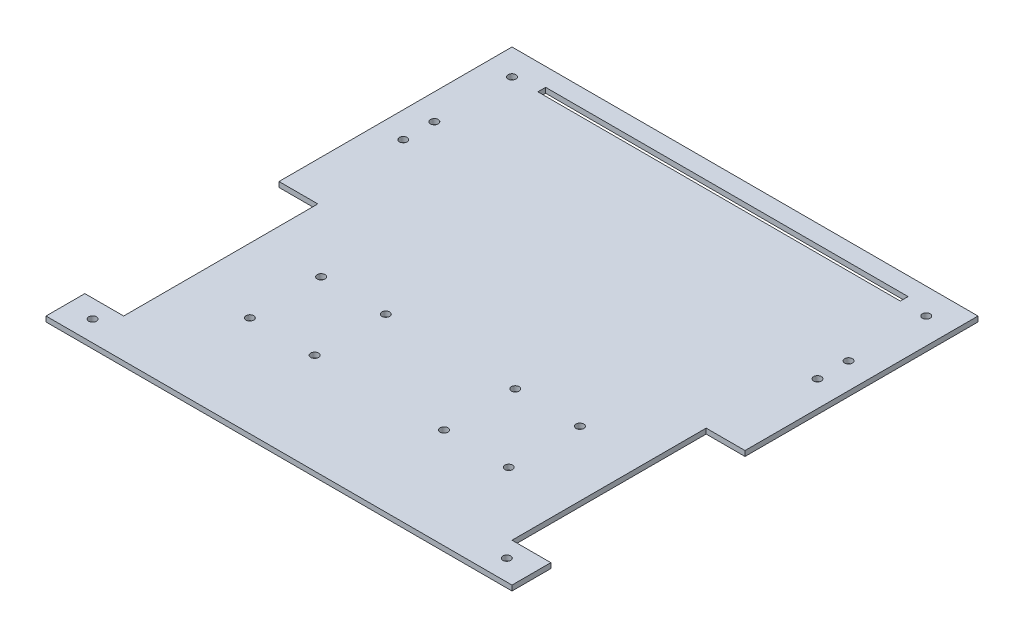
ISO-10303-21;
HEADER;
FILE_DESCRIPTION(('STEP AP214'),'2;1');
FILE_NAME('part.step','',(''),(''),'','','');
FILE_SCHEMA(('AUTOMOTIVE_DESIGN { 1 0 10303 214 1 1 1 1 }'));
ENDSEC;
DATA;
#1=APPLICATION_CONTEXT('core data for automotive mechanical design processes');
#2=APPLICATION_PROTOCOL_DEFINITION('international standard','automotive_design',2000,#1);
#3=PRODUCT_CONTEXT('',#1,'mechanical');
#4=PRODUCT('Part','Part','',(#3));
#5=PRODUCT_RELATED_PRODUCT_CATEGORY('part','',(#4));
#6=PRODUCT_DEFINITION_FORMATION('','',#4);
#7=PRODUCT_DEFINITION_CONTEXT('part definition',#1,'design');
#8=PRODUCT_DEFINITION('design','',#6,#7);
#9=PRODUCT_DEFINITION_SHAPE('','',#8);
#10=(LENGTH_UNIT() NAMED_UNIT(*) SI_UNIT(.MILLI.,.METRE.));
#11=(NAMED_UNIT(*) PLANE_ANGLE_UNIT() SI_UNIT($,.RADIAN.));
#12=(NAMED_UNIT(*) SI_UNIT($,.STERADIAN.) SOLID_ANGLE_UNIT());
#13=UNCERTAINTY_MEASURE_WITH_UNIT(LENGTH_MEASURE(1.E-05),#10,'distance_accuracy_value','');
#14=(GEOMETRIC_REPRESENTATION_CONTEXT(3) GLOBAL_UNCERTAINTY_ASSIGNED_CONTEXT((#13)) GLOBAL_UNIT_ASSIGNED_CONTEXT((#10,
#11,#12)) REPRESENTATION_CONTEXT('',''));
#15=CARTESIAN_POINT('',(0.,0.,0.));
#16=DIRECTION('',(0.,0.,1.));
#17=DIRECTION('',(1.,0.,0.));
#18=AXIS2_PLACEMENT_3D('',#15,#16,#17);
#19=CARTESIAN_POINT('',(90.,2.,-90.));
#20=DIRECTION('',(-1.,0.,0.));
#21=DIRECTION('',(0.,0.,1.));
#22=AXIS2_PLACEMENT_3D('',#19,#20,#21);
#23=PLANE('',#22);
#24=DIRECTION('',(0.,0.,-1.));
#25=VECTOR('',#24,1.);
#26=CARTESIAN_POINT('',(90.,0.,-90.));
#27=LINE('',#26,#25);
#28=CARTESIAN_POINT('',(90.,0.,90.));
#29=VERTEX_POINT('',#28);
#30=CARTESIAN_POINT('',(90.,0.,75.));
#31=VERTEX_POINT('',#30);
#32=EDGE_CURVE('E354',#29,#31,#27,.T.);
#33=ORIENTED_EDGE('',*,*,#32,.T.);
#34=DIRECTION('',(0.,1.,0.));
#35=VECTOR('',#34,1.);
#36=CARTESIAN_POINT('',(90.,0.,75.));
#37=LINE('',#36,#35);
#38=CARTESIAN_POINT('',(90.,2.,75.));
#39=VERTEX_POINT('',#38);
#40=EDGE_CURVE('E266',#31,#39,#37,.T.);
#41=ORIENTED_EDGE('',*,*,#40,.T.);
#42=DIRECTION('',(0.,0.,-1.));
#43=VECTOR('',#42,1.);
#44=CARTESIAN_POINT('',(90.,2.,-90.));
#45=LINE('',#44,#43);
#46=CARTESIAN_POINT('',(90.,2.,90.));
#47=VERTEX_POINT('',#46);
#48=EDGE_CURVE('E337',#47,#39,#45,.T.);
#49=ORIENTED_EDGE('',*,*,#48,.F.);
#50=DIRECTION('',(0.,-1.,0.));
#51=VECTOR('',#50,1.);
#52=CARTESIAN_POINT('',(90.,2.,90.));
#53=LINE('',#52,#51);
#54=EDGE_CURVE('E353',#47,#29,#53,.T.);
#55=ORIENTED_EDGE('',*,*,#54,.T.);
#56=EDGE_LOOP('',(#33,#41,#49,#55));
#57=FACE_BOUND('',#56,.T.);
#58=ADVANCED_FACE('F39',(#57),#23,.F.);
#59=CARTESIAN_POINT('',(-90.,2.,-90.));
#60=DIRECTION('',(1.,0.,0.));
#61=DIRECTION('',(0.,0.,-1.));
#62=AXIS2_PLACEMENT_3D('',#59,#60,#61);
#63=PLANE('',#62);
#64=DIRECTION('',(0.,0.,1.));
#65=VECTOR('',#64,1.);
#66=CARTESIAN_POINT('',(-90.,0.,-90.));
#67=LINE('',#66,#65);
#68=CARTESIAN_POINT('',(-90.,0.,-90.));
#69=VERTEX_POINT('',#68);
#70=CARTESIAN_POINT('',(-90.,0.,0.));
#71=VERTEX_POINT('',#70);
#72=EDGE_CURVE('E362',#69,#71,#67,.T.);
#73=ORIENTED_EDGE('',*,*,#72,.T.);
#74=DIRECTION('',(0.,1.,0.));
#75=VECTOR('',#74,1.);
#76=CARTESIAN_POINT('',(-90.,0.,0.));
#77=LINE('',#76,#75);
#78=CARTESIAN_POINT('',(-90.,2.,0.));
#79=VERTEX_POINT('',#78);
#80=EDGE_CURVE('E324',#71,#79,#77,.T.);
#81=ORIENTED_EDGE('',*,*,#80,.T.);
#82=DIRECTION('',(0.,0.,1.));
#83=VECTOR('',#82,1.);
#84=CARTESIAN_POINT('',(-90.,2.,-90.));
#85=LINE('',#84,#83);
#86=CARTESIAN_POINT('',(-90.,2.,-90.));
#87=VERTEX_POINT('',#86);
#88=EDGE_CURVE('E346',#87,#79,#85,.T.);
#89=ORIENTED_EDGE('',*,*,#88,.F.);
#90=DIRECTION('',(0.,-1.,0.));
#91=VECTOR('',#90,1.);
#92=CARTESIAN_POINT('',(-90.,2.,-90.));
#93=LINE('',#92,#91);
#94=EDGE_CURVE('E49',#87,#69,#93,.T.);
#95=ORIENTED_EDGE('',*,*,#94,.T.);
#96=EDGE_LOOP('',(#73,#81,#89,#95));
#97=FACE_BOUND('',#96,.T.);
#98=ADVANCED_FACE('F427',(#97),#63,.F.);
#99=CARTESIAN_POINT('',(90.,2.,0.));
#100=VERTEX_POINT('',#99);
#101=CARTESIAN_POINT('',(90.,2.,-90.));
#102=VERTEX_POINT('',#101);
#103=EDGE_CURVE('E342',#100,#102,#45,.T.);
#104=ORIENTED_EDGE('',*,*,#103,.F.);
#105=DIRECTION('',(0.,1.,0.));
#106=VECTOR('',#105,1.);
#107=CARTESIAN_POINT('',(90.,0.,0.));
#108=LINE('',#107,#106);
#109=CARTESIAN_POINT('',(90.,0.,0.));
#110=VERTEX_POINT('',#109);
#111=EDGE_CURVE('E254',#110,#100,#108,.T.);
#112=ORIENTED_EDGE('',*,*,#111,.F.);
#113=CARTESIAN_POINT('',(90.,0.,-90.));
#114=VERTEX_POINT('',#113);
#115=EDGE_CURVE('E328',#110,#114,#27,.T.);
#116=ORIENTED_EDGE('',*,*,#115,.T.);
#117=DIRECTION('',(0.,-1.,0.));
#118=VECTOR('',#117,1.);
#119=CARTESIAN_POINT('',(90.,2.,-90.));
#120=LINE('',#119,#118);
#121=EDGE_CURVE('E11',#102,#114,#120,.T.);
#122=ORIENTED_EDGE('',*,*,#121,.F.);
#123=EDGE_LOOP('',(#104,#112,#116,#122));
#124=FACE_BOUND('',#123,.T.);
#125=ADVANCED_FACE('F41',(#124),#23,.F.);
#126=CARTESIAN_POINT('',(-90.,2.,-90.));
#127=DIRECTION('',(0.,0.,1.));
#128=DIRECTION('',(1.,0.,0.));
#129=AXIS2_PLACEMENT_3D('',#126,#127,#128);
#130=PLANE('',#129);
#131=DIRECTION('',(-1.,0.,0.));
#132=VECTOR('',#131,1.);
#133=CARTESIAN_POINT('',(-90.,0.,-90.));
#134=LINE('',#133,#132);
#135=EDGE_CURVE('E358',#114,#69,#134,.T.);
#136=ORIENTED_EDGE('',*,*,#135,.T.);
#137=ORIENTED_EDGE('',*,*,#94,.F.);
#138=DIRECTION('',(-1.,0.,0.));
#139=VECTOR('',#138,1.);
#140=CARTESIAN_POINT('',(-90.,2.,-90.));
#141=LINE('',#140,#139);
#142=EDGE_CURVE('E341',#102,#87,#141,.T.);
#143=ORIENTED_EDGE('',*,*,#142,.F.);
#144=ORIENTED_EDGE('',*,*,#121,.T.);
#145=EDGE_LOOP('',(#136,#137,#143,#144));
#146=FACE_BOUND('',#145,.T.);
#147=ADVANCED_FACE('F436',(#146),#130,.F.);
#148=CARTESIAN_POINT('',(-90.,2.,75.));
#149=VERTEX_POINT('',#148);
#150=CARTESIAN_POINT('',(-90.,2.,90.));
#151=VERTEX_POINT('',#150);
#152=EDGE_CURVE('E345',#149,#151,#85,.T.);
#153=ORIENTED_EDGE('',*,*,#152,.F.);
#154=DIRECTION('',(0.,1.,0.));
#155=VECTOR('',#154,1.);
#156=CARTESIAN_POINT('',(-90.,0.,75.));
#157=LINE('',#156,#155);
#158=CARTESIAN_POINT('',(-90.,0.,75.));
#159=VERTEX_POINT('',#158);
#160=EDGE_CURVE('E314',#159,#149,#157,.T.);
#161=ORIENTED_EDGE('',*,*,#160,.F.);
#162=CARTESIAN_POINT('',(-90.,0.,90.));
#163=VERTEX_POINT('',#162);
#164=EDGE_CURVE('E361',#159,#163,#67,.T.);
#165=ORIENTED_EDGE('',*,*,#164,.T.);
#166=DIRECTION('',(0.,-1.,0.));
#167=VECTOR('',#166,1.);
#168=CARTESIAN_POINT('',(-90.,2.,90.));
#169=LINE('',#168,#167);
#170=EDGE_CURVE('E372',#151,#163,#169,.T.);
#171=ORIENTED_EDGE('',*,*,#170,.F.);
#172=EDGE_LOOP('',(#153,#161,#165,#171));
#173=FACE_BOUND('',#172,.T.);
#174=ADVANCED_FACE('F434',(#173),#63,.F.);
#175=CARTESIAN_POINT('',(-90.,2.,90.));
#176=DIRECTION('',(0.,0.,-1.));
#177=DIRECTION('',(-1.,0.,0.));
#178=AXIS2_PLACEMENT_3D('',#175,#176,#177);
#179=PLANE('',#178);
#180=DIRECTION('',(1.,0.,0.));
#181=VECTOR('',#180,1.);
#182=CARTESIAN_POINT('',(-90.,0.,90.));
#183=LINE('',#182,#181);
#184=EDGE_CURVE('E366',#163,#29,#183,.T.);
#185=ORIENTED_EDGE('',*,*,#184,.T.);
#186=ORIENTED_EDGE('',*,*,#54,.F.);
#187=DIRECTION('',(1.,0.,0.));
#188=VECTOR('',#187,1.);
#189=CARTESIAN_POINT('',(-90.,2.,90.));
#190=LINE('',#189,#188);
#191=EDGE_CURVE('E350',#151,#47,#190,.T.);
#192=ORIENTED_EDGE('',*,*,#191,.F.);
#193=ORIENTED_EDGE('',*,*,#170,.T.);
#194=EDGE_LOOP('',(#185,#186,#192,#193));
#195=FACE_BOUND('',#194,.T.);
#196=ADVANCED_FACE('F463',(#195),#179,.F.);
#197=CARTESIAN_POINT('',(0.,2.,0.));
#198=DIRECTION('',(0.,1.,0.));
#199=DIRECTION('',(0.,0.,1.));
#200=AXIS2_PLACEMENT_3D('',#197,#198,#199);
#201=PLANE('',#200);
#202=CARTESIAN_POINT('',(25.,2.,23.75));
#203=DIRECTION('',(0.,1.,0.));
#204=DIRECTION('',(0.,0.,1.));
#205=AXIS2_PLACEMENT_3D('',#202,#203,#204);
#206=CIRCLE('',#205,1.5);
#207=CARTESIAN_POINT('',(25.,2.,25.25));
#208=VERTEX_POINT('',#207);
#209=EDGE_CURVE('E819',#208,#208,#206,.T.);
#210=ORIENTED_EDGE('',*,*,#209,.F.);
#211=EDGE_LOOP('',(#210));
#212=FACE_BOUND('',#211,.T.);
#213=CARTESIAN_POINT('',(-25.,2.,51.25));
#214=DIRECTION('',(0.,1.,0.));
#215=DIRECTION('',(0.,0.,1.));
#216=AXIS2_PLACEMENT_3D('',#213,#214,#215);
#217=CIRCLE('',#216,1.5);
#218=CARTESIAN_POINT('',(-25.,2.,52.75));
#219=VERTEX_POINT('',#218);
#220=EDGE_CURVE('E812',#219,#219,#217,.T.);
#221=ORIENTED_EDGE('',*,*,#220,.F.);
#222=EDGE_LOOP('',(#221));
#223=FACE_BOUND('',#222,.T.);
#224=CARTESIAN_POINT('',(-25.,2.,23.75));
#225=DIRECTION('',(0.,1.,0.));
#226=DIRECTION('',(0.,0.,1.));
#227=AXIS2_PLACEMENT_3D('',#224,#225,#226);
#228=CIRCLE('',#227,1.5);
#229=CARTESIAN_POINT('',(-25.,2.,25.25));
#230=VERTEX_POINT('',#229);
#231=EDGE_CURVE('E754',#230,#230,#228,.T.);
#232=ORIENTED_EDGE('',*,*,#231,.F.);
#233=EDGE_LOOP('',(#232));
#234=FACE_BOUND('',#233,.T.);
#235=CARTESIAN_POINT('',(-50.,2.,51.25));
#236=DIRECTION('',(0.,1.,0.));
#237=DIRECTION('',(0.,0.,1.));
#238=AXIS2_PLACEMENT_3D('',#235,#236,#237);
#239=CIRCLE('',#238,1.5);
#240=CARTESIAN_POINT('',(-50.,2.,52.75));
#241=VERTEX_POINT('',#240);
#242=EDGE_CURVE('E811',#241,#241,#239,.T.);
#243=ORIENTED_EDGE('',*,*,#242,.F.);
#244=EDGE_LOOP('',(#243));
#245=FACE_BOUND('',#244,.T.);
#246=CARTESIAN_POINT('',(50.,2.,51.25));
#247=DIRECTION('',(0.,1.,0.));
#248=DIRECTION('',(0.,0.,1.));
#249=AXIS2_PLACEMENT_3D('',#246,#247,#248);
#250=CIRCLE('',#249,1.5);
#251=CARTESIAN_POINT('',(50.,2.,52.75));
#252=VERTEX_POINT('',#251);
#253=EDGE_CURVE('E834',#252,#252,#250,.T.);
#254=ORIENTED_EDGE('',*,*,#253,.F.);
#255=EDGE_LOOP('',(#254));
#256=FACE_BOUND('',#255,.T.);
#257=CARTESIAN_POINT('',(25.,2.,51.25));
#258=DIRECTION('',(0.,1.,0.));
#259=DIRECTION('',(0.,0.,1.));
#260=AXIS2_PLACEMENT_3D('',#257,#258,#259);
#261=CIRCLE('',#260,1.5);
#262=CARTESIAN_POINT('',(25.,2.,52.75));
#263=VERTEX_POINT('',#262);
#264=EDGE_CURVE('E830',#263,#263,#261,.T.);
#265=ORIENTED_EDGE('',*,*,#264,.F.);
#266=EDGE_LOOP('',(#265));
#267=FACE_BOUND('',#266,.T.);
#268=CARTESIAN_POINT('',(50.,2.,23.75));
#269=DIRECTION('',(0.,1.,0.));
#270=DIRECTION('',(0.,0.,1.));
#271=AXIS2_PLACEMENT_3D('',#268,#269,#270);
#272=CIRCLE('',#271,1.5);
#273=CARTESIAN_POINT('',(50.,2.,25.25));
#274=VERTEX_POINT('',#273);
#275=EDGE_CURVE('E828',#274,#274,#272,.T.);
#276=ORIENTED_EDGE('',*,*,#275,.F.);
#277=EDGE_LOOP('',(#276));
#278=FACE_BOUND('',#277,.T.);
#279=CARTESIAN_POINT('',(-50.,2.,23.75));
#280=DIRECTION('',(0.,1.,0.));
#281=DIRECTION('',(0.,0.,1.));
#282=AXIS2_PLACEMENT_3D('',#279,#280,#281);
#283=CIRCLE('',#282,1.5);
#284=CARTESIAN_POINT('',(-50.,2.,25.25));
#285=VERTEX_POINT('',#284);
#286=EDGE_CURVE('E384',#285,#285,#283,.T.);
#287=ORIENTED_EDGE('',*,*,#286,.F.);
#288=EDGE_LOOP('',(#287));
#289=FACE_BOUND('',#288,.T.);
#290=CARTESIAN_POINT('',(80.,2.,-38.));
#291=DIRECTION('',(0.,1.,0.));
#292=DIRECTION('',(0.,0.,-1.));
#293=AXIS2_PLACEMENT_3D('',#290,#291,#292);
#294=CIRCLE('',#293,1.5);
#295=CARTESIAN_POINT('',(80.,2.,-39.5));
#296=VERTEX_POINT('',#295);
#297=EDGE_CURVE('E232',#296,#296,#294,.T.);
#298=ORIENTED_EDGE('',*,*,#297,.F.);
#299=EDGE_LOOP('',(#298));
#300=FACE_BOUND('',#299,.T.);
#301=CARTESIAN_POINT('',(-80.,2.,-80.));
#302=DIRECTION('',(0.,1.,0.));
#303=DIRECTION('',(0.,0.,1.));
#304=AXIS2_PLACEMENT_3D('',#301,#302,#303);
#305=CIRCLE('',#304,1.5);
#306=CARTESIAN_POINT('',(-80.,2.,-78.5));
#307=VERTEX_POINT('',#306);
#308=EDGE_CURVE('E213',#307,#307,#305,.T.);
#309=ORIENTED_EDGE('',*,*,#308,.F.);
#310=EDGE_LOOP('',(#309));
#311=FACE_BOUND('',#310,.T.);
#312=CARTESIAN_POINT('',(-80.,2.,-50.));
#313=DIRECTION('',(0.,1.,0.));
#314=DIRECTION('',(0.,0.,1.));
#315=AXIS2_PLACEMENT_3D('',#312,#313,#314);
#316=CIRCLE('',#315,1.5);
#317=CARTESIAN_POINT('',(-80.,2.,-48.5));
#318=VERTEX_POINT('',#317);
#319=EDGE_CURVE('E214',#318,#318,#316,.T.);
#320=ORIENTED_EDGE('',*,*,#319,.F.);
#321=EDGE_LOOP('',(#320));
#322=FACE_BOUND('',#321,.T.);
#323=CARTESIAN_POINT('',(80.,2.,-50.));
#324=DIRECTION('',(0.,1.,0.));
#325=DIRECTION('',(0.,0.,-1.));
#326=AXIS2_PLACEMENT_3D('',#323,#324,#325);
#327=CIRCLE('',#326,1.5);
#328=CARTESIAN_POINT('',(80.,2.,-51.5));
#329=VERTEX_POINT('',#328);
#330=EDGE_CURVE('E222',#329,#329,#327,.T.);
#331=ORIENTED_EDGE('',*,*,#330,.F.);
#332=EDGE_LOOP('',(#331));
#333=FACE_BOUND('',#332,.T.);
#334=CARTESIAN_POINT('',(80.,2.,82.));
#335=DIRECTION('',(0.,1.,0.));
#336=DIRECTION('',(0.,0.,-1.));
#337=AXIS2_PLACEMENT_3D('',#334,#335,#336);
#338=CIRCLE('',#337,1.5);
#339=CARTESIAN_POINT('',(80.,2.,80.5));
#340=VERTEX_POINT('',#339);
#341=EDGE_CURVE('E231',#340,#340,#338,.T.);
#342=ORIENTED_EDGE('',*,*,#341,.F.);
#343=EDGE_LOOP('',(#342));
#344=FACE_BOUND('',#343,.T.);
#345=CARTESIAN_POINT('',(-80.,2.,82.));
#346=DIRECTION('',(0.,1.,0.));
#347=DIRECTION('',(0.,0.,1.));
#348=AXIS2_PLACEMENT_3D('',#345,#346,#347);
#349=CIRCLE('',#348,1.5);
#350=CARTESIAN_POINT('',(-80.,2.,83.5));
#351=VERTEX_POINT('',#350);
#352=EDGE_CURVE('E290',#351,#351,#349,.T.);
#353=ORIENTED_EDGE('',*,*,#352,.F.);
#354=EDGE_LOOP('',(#353));
#355=FACE_BOUND('',#354,.T.);
#356=CARTESIAN_POINT('',(-80.,2.,-38.));
#357=DIRECTION('',(0.,1.,0.));
#358=DIRECTION('',(0.,0.,1.));
#359=AXIS2_PLACEMENT_3D('',#356,#357,#358);
#360=CIRCLE('',#359,1.5);
#361=CARTESIAN_POINT('',(-80.,2.,-36.5));
#362=VERTEX_POINT('',#361);
#363=EDGE_CURVE('E282',#362,#362,#360,.T.);
#364=ORIENTED_EDGE('',*,*,#363,.F.);
#365=EDGE_LOOP('',(#364));
#366=FACE_BOUND('',#365,.T.);
#367=DIRECTION('',(1.,0.,0.));
#368=VECTOR('',#367,1.);
#369=CARTESIAN_POINT('',(90.,2.,75.));
#370=LINE('',#369,#368);
#371=CARTESIAN_POINT('',(75.,2.,75.));
#372=VERTEX_POINT('',#371);
#373=EDGE_CURVE('E247',#372,#39,#370,.T.);
#374=ORIENTED_EDGE('',*,*,#373,.F.);
#375=DIRECTION('',(0.,0.,1.));
#376=VECTOR('',#375,1.);
#377=CARTESIAN_POINT('',(75.,2.,0.));
#378=LINE('',#377,#376);
#379=CARTESIAN_POINT('',(75.,2.,0.));
#380=VERTEX_POINT('',#379);
#381=EDGE_CURVE('E259',#380,#372,#378,.T.);
#382=ORIENTED_EDGE('',*,*,#381,.F.);
#383=DIRECTION('',(-1.,0.,0.));
#384=VECTOR('',#383,1.);
#385=CARTESIAN_POINT('',(90.,2.,0.));
#386=LINE('',#385,#384);
#387=EDGE_CURVE('E255',#100,#380,#386,.T.);
#388=ORIENTED_EDGE('',*,*,#387,.F.);
#389=ORIENTED_EDGE('',*,*,#103,.T.);
#390=ORIENTED_EDGE('',*,*,#142,.T.);
#391=ORIENTED_EDGE('',*,*,#88,.T.);
#392=DIRECTION('',(-1.,0.,0.));
#393=VECTOR('',#392,1.);
#394=CARTESIAN_POINT('',(-90.,2.,0.));
#395=LINE('',#394,#393);
#396=CARTESIAN_POINT('',(-75.,2.,0.));
#397=VERTEX_POINT('',#396);
#398=EDGE_CURVE('E306',#397,#79,#395,.T.);
#399=ORIENTED_EDGE('',*,*,#398,.F.);
#400=DIRECTION('',(0.,0.,-1.));
#401=VECTOR('',#400,1.);
#402=CARTESIAN_POINT('',(-75.,2.,0.));
#403=LINE('',#402,#401);
#404=CARTESIAN_POINT('',(-75.,2.,75.));
#405=VERTEX_POINT('',#404);
#406=EDGE_CURVE('E318',#405,#397,#403,.T.);
#407=ORIENTED_EDGE('',*,*,#406,.F.);
#408=DIRECTION('',(1.,0.,0.));
#409=VECTOR('',#408,1.);
#410=CARTESIAN_POINT('',(-90.,2.,75.));
#411=LINE('',#410,#409);
#412=EDGE_CURVE('E270',#149,#405,#411,.T.);
#413=ORIENTED_EDGE('',*,*,#412,.F.);
#414=ORIENTED_EDGE('',*,*,#152,.T.);
#415=ORIENTED_EDGE('',*,*,#191,.T.);
#416=ORIENTED_EDGE('',*,*,#48,.T.);
#417=EDGE_LOOP('',(#374,#382,#388,#389,#390,#391,#399,#407,#413,#414,#415,#416));
#418=FACE_BOUND('',#417,.T.);
#419=CARTESIAN_POINT('',(80.,2.,-80.));
#420=DIRECTION('',(0.,1.,0.));
#421=DIRECTION('',(0.,0.,-1.));
#422=AXIS2_PLACEMENT_3D('',#419,#420,#421);
#423=CIRCLE('',#422,1.5);
#424=CARTESIAN_POINT('',(80.,2.,-81.5));
#425=VERTEX_POINT('',#424);
#426=EDGE_CURVE('E186',#425,#425,#423,.T.);
#427=ORIENTED_EDGE('',*,*,#426,.F.);
#428=EDGE_LOOP('',(#427));
#429=FACE_BOUND('',#428,.T.);
#430=DIRECTION('',(0.,0.,1.));
#431=VECTOR('',#430,1.);
#432=CARTESIAN_POINT('',(-70.,2.,-82.9999999999999));
#433=LINE('',#432,#431);
#434=CARTESIAN_POINT('',(-70.,2.,-82.9999999999999));
#435=VERTEX_POINT('',#434);
#436=CARTESIAN_POINT('',(-70.,2.,-80.));
#437=VERTEX_POINT('',#436);
#438=EDGE_CURVE('E57',#435,#437,#433,.T.);
#439=ORIENTED_EDGE('',*,*,#438,.F.);
#440=DIRECTION('',(-1.,0.,0.));
#441=VECTOR('',#440,1.);
#442=CARTESIAN_POINT('',(-70.,2.,-82.9999999999999));
#443=LINE('',#442,#441);
#444=CARTESIAN_POINT('',(70.,2.,-83.));
#445=VERTEX_POINT('',#444);
#446=EDGE_CURVE('E179',#445,#435,#443,.T.);
#447=ORIENTED_EDGE('',*,*,#446,.F.);
#448=DIRECTION('',(0.,0.,-1.));
#449=VECTOR('',#448,1.);
#450=CARTESIAN_POINT('',(70.,2.,-83.));
#451=LINE('',#450,#449);
#452=CARTESIAN_POINT('',(70.,2.,-80.));
#453=VERTEX_POINT('',#452);
#454=EDGE_CURVE('E183',#453,#445,#451,.T.);
#455=ORIENTED_EDGE('',*,*,#454,.F.);
#456=DIRECTION('',(1.,0.,0.));
#457=VECTOR('',#456,1.);
#458=CARTESIAN_POINT('',(-70.,2.,-80.));
#459=LINE('',#458,#457);
#460=EDGE_CURVE('E195',#437,#453,#459,.T.);
#461=ORIENTED_EDGE('',*,*,#460,.F.);
#462=EDGE_LOOP('',(#439,#447,#455,#461));
#463=FACE_BOUND('',#462,.T.);
#464=ADVANCED_FACE('F460',(#212,#223,#234,#245,#256,#267,#278,#289,#300,#311,#322,#333,#344,
#355,#366,#418,#429,#463),#201,.T.);
#465=CARTESIAN_POINT('',(0.,0.,0.));
#466=DIRECTION('',(0.,1.,0.));
#467=DIRECTION('',(0.,0.,1.));
#468=AXIS2_PLACEMENT_3D('',#465,#466,#467);
#469=PLANE('',#468);
#470=CARTESIAN_POINT('',(25.,0.,23.75));
#471=DIRECTION('',(0.,1.,0.));
#472=DIRECTION('',(0.,0.,1.));
#473=AXIS2_PLACEMENT_3D('',#470,#471,#472);
#474=CIRCLE('',#473,1.5);
#475=CARTESIAN_POINT('',(25.,0.,25.25));
#476=VERTEX_POINT('',#475);
#477=EDGE_CURVE('E43',#476,#476,#474,.T.);
#478=ORIENTED_EDGE('',*,*,#477,.T.);
#479=EDGE_LOOP('',(#478));
#480=FACE_BOUND('',#479,.T.);
#481=CARTESIAN_POINT('',(-25.,0.,51.25));
#482=DIRECTION('',(0.,1.,0.));
#483=DIRECTION('',(0.,0.,1.));
#484=AXIS2_PLACEMENT_3D('',#481,#482,#483);
#485=CIRCLE('',#484,1.5);
#486=CARTESIAN_POINT('',(-25.,0.,52.75));
#487=VERTEX_POINT('',#486);
#488=EDGE_CURVE('E403',#487,#487,#485,.T.);
#489=ORIENTED_EDGE('',*,*,#488,.T.);
#490=EDGE_LOOP('',(#489));
#491=FACE_BOUND('',#490,.T.);
#492=CARTESIAN_POINT('',(-25.,0.,23.75));
#493=DIRECTION('',(0.,1.,0.));
#494=DIRECTION('',(0.,0.,1.));
#495=AXIS2_PLACEMENT_3D('',#492,#493,#494);
#496=CIRCLE('',#495,1.5);
#497=CARTESIAN_POINT('',(-25.,0.,25.25));
#498=VERTEX_POINT('',#497);
#499=EDGE_CURVE('E400',#498,#498,#496,.T.);
#500=ORIENTED_EDGE('',*,*,#499,.T.);
#501=EDGE_LOOP('',(#500));
#502=FACE_BOUND('',#501,.T.);
#503=CARTESIAN_POINT('',(-50.,0.,51.25));
#504=DIRECTION('',(0.,1.,0.));
#505=DIRECTION('',(0.,0.,1.));
#506=AXIS2_PLACEMENT_3D('',#503,#504,#505);
#507=CIRCLE('',#506,1.5);
#508=CARTESIAN_POINT('',(-50.,0.,52.75));
#509=VERTEX_POINT('',#508);
#510=EDGE_CURVE('E396',#509,#509,#507,.T.);
#511=ORIENTED_EDGE('',*,*,#510,.T.);
#512=EDGE_LOOP('',(#511));
#513=FACE_BOUND('',#512,.T.);
#514=CARTESIAN_POINT('',(50.,0.,51.25));
#515=DIRECTION('',(0.,1.,0.));
#516=DIRECTION('',(0.,0.,1.));
#517=AXIS2_PLACEMENT_3D('',#514,#515,#516);
#518=CIRCLE('',#517,1.5);
#519=CARTESIAN_POINT('',(50.,0.,52.75));
#520=VERTEX_POINT('',#519);
#521=EDGE_CURVE('E392',#520,#520,#518,.T.);
#522=ORIENTED_EDGE('',*,*,#521,.T.);
#523=EDGE_LOOP('',(#522));
#524=FACE_BOUND('',#523,.T.);
#525=CARTESIAN_POINT('',(25.,0.,51.25));
#526=DIRECTION('',(0.,1.,0.));
#527=DIRECTION('',(0.,0.,1.));
#528=AXIS2_PLACEMENT_3D('',#525,#526,#527);
#529=CIRCLE('',#528,1.5);
#530=CARTESIAN_POINT('',(25.,0.,52.75));
#531=VERTEX_POINT('',#530);
#532=EDGE_CURVE('E388',#531,#531,#529,.T.);
#533=ORIENTED_EDGE('',*,*,#532,.T.);
#534=EDGE_LOOP('',(#533));
#535=FACE_BOUND('',#534,.T.);
#536=CARTESIAN_POINT('',(50.,0.,23.75));
#537=DIRECTION('',(0.,1.,0.));
#538=DIRECTION('',(0.,0.,1.));
#539=AXIS2_PLACEMENT_3D('',#536,#537,#538);
#540=CIRCLE('',#539,1.5);
#541=CARTESIAN_POINT('',(50.,0.,25.25));
#542=VERTEX_POINT('',#541);
#543=EDGE_CURVE('E383',#542,#542,#540,.T.);
#544=ORIENTED_EDGE('',*,*,#543,.T.);
#545=EDGE_LOOP('',(#544));
#546=FACE_BOUND('',#545,.T.);
#547=CARTESIAN_POINT('',(-50.,0.,23.75));
#548=DIRECTION('',(0.,1.,0.));
#549=DIRECTION('',(0.,0.,1.));
#550=AXIS2_PLACEMENT_3D('',#547,#548,#549);
#551=CIRCLE('',#550,1.5);
#552=CARTESIAN_POINT('',(-50.,0.,25.25));
#553=VERTEX_POINT('',#552);
#554=EDGE_CURVE('E379',#553,#553,#551,.T.);
#555=ORIENTED_EDGE('',*,*,#554,.T.);
#556=EDGE_LOOP('',(#555));
#557=FACE_BOUND('',#556,.T.);
#558=CARTESIAN_POINT('',(80.,0.,-38.));
#559=DIRECTION('',(0.,1.,0.));
#560=DIRECTION('',(0.,0.,-1.));
#561=AXIS2_PLACEMENT_3D('',#558,#559,#560);
#562=CIRCLE('',#561,1.5);
#563=CARTESIAN_POINT('',(80.,0.,-39.5));
#564=VERTEX_POINT('',#563);
#565=EDGE_CURVE('E227',#564,#564,#562,.T.);
#566=ORIENTED_EDGE('',*,*,#565,.T.);
#567=EDGE_LOOP('',(#566));
#568=FACE_BOUND('',#567,.T.);
#569=CARTESIAN_POINT('',(-80.,0.,-80.));
#570=DIRECTION('',(0.,1.,0.));
#571=DIRECTION('',(0.,0.,1.));
#572=AXIS2_PLACEMENT_3D('',#569,#570,#571);
#573=CIRCLE('',#572,1.5);
#574=CARTESIAN_POINT('',(-80.,0.,-78.5));
#575=VERTEX_POINT('',#574);
#576=EDGE_CURVE('E236',#575,#575,#573,.T.);
#577=ORIENTED_EDGE('',*,*,#576,.T.);
#578=EDGE_LOOP('',(#577));
#579=FACE_BOUND('',#578,.T.);
#580=CARTESIAN_POINT('',(-80.,0.,-50.));
#581=DIRECTION('',(0.,1.,0.));
#582=DIRECTION('',(0.,0.,1.));
#583=AXIS2_PLACEMENT_3D('',#580,#581,#582);
#584=CIRCLE('',#583,1.5);
#585=CARTESIAN_POINT('',(-80.,0.,-48.5));
#586=VERTEX_POINT('',#585);
#587=EDGE_CURVE('E209',#586,#586,#584,.T.);
#588=ORIENTED_EDGE('',*,*,#587,.T.);
#589=EDGE_LOOP('',(#588));
#590=FACE_BOUND('',#589,.T.);
#591=CARTESIAN_POINT('',(80.,0.,-50.));
#592=DIRECTION('',(0.,1.,0.));
#593=DIRECTION('',(0.,0.,-1.));
#594=AXIS2_PLACEMENT_3D('',#591,#592,#593);
#595=CIRCLE('',#594,1.5);
#596=CARTESIAN_POINT('',(80.,0.,-51.5));
#597=VERTEX_POINT('',#596);
#598=EDGE_CURVE('E218',#597,#597,#595,.T.);
#599=ORIENTED_EDGE('',*,*,#598,.T.);
#600=EDGE_LOOP('',(#599));
#601=FACE_BOUND('',#600,.T.);
#602=CARTESIAN_POINT('',(80.,0.,82.));
#603=DIRECTION('',(0.,1.,0.));
#604=DIRECTION('',(0.,0.,-1.));
#605=AXIS2_PLACEMENT_3D('',#602,#603,#604);
#606=CIRCLE('',#605,1.5);
#607=CARTESIAN_POINT('',(80.,0.,80.5));
#608=VERTEX_POINT('',#607);
#609=EDGE_CURVE('E294',#608,#608,#606,.T.);
#610=ORIENTED_EDGE('',*,*,#609,.T.);
#611=EDGE_LOOP('',(#610));
#612=FACE_BOUND('',#611,.T.);
#613=CARTESIAN_POINT('',(-80.,0.,82.));
#614=DIRECTION('',(0.,1.,0.));
#615=DIRECTION('',(0.,0.,1.));
#616=AXIS2_PLACEMENT_3D('',#613,#614,#615);
#617=CIRCLE('',#616,1.5);
#618=CARTESIAN_POINT('',(-80.,0.,83.5));
#619=VERTEX_POINT('',#618);
#620=EDGE_CURVE('E286',#619,#619,#617,.T.);
#621=ORIENTED_EDGE('',*,*,#620,.T.);
#622=EDGE_LOOP('',(#621));
#623=FACE_BOUND('',#622,.T.);
#624=CARTESIAN_POINT('',(-80.,0.,-38.));
#625=DIRECTION('',(0.,1.,0.));
#626=DIRECTION('',(0.,0.,1.));
#627=AXIS2_PLACEMENT_3D('',#624,#625,#626);
#628=CIRCLE('',#627,1.5);
#629=CARTESIAN_POINT('',(-80.,0.,-36.5));
#630=VERTEX_POINT('',#629);
#631=EDGE_CURVE('E260',#630,#630,#628,.T.);
#632=ORIENTED_EDGE('',*,*,#631,.T.);
#633=EDGE_LOOP('',(#632));
#634=FACE_BOUND('',#633,.T.);
#635=CARTESIAN_POINT('',(80.,0.,-80.));
#636=DIRECTION('',(0.,1.,0.));
#637=DIRECTION('',(0.,0.,-1.));
#638=AXIS2_PLACEMENT_3D('',#635,#636,#637);
#639=CIRCLE('',#638,1.5);
#640=CARTESIAN_POINT('',(80.,0.,-81.5));
#641=VERTEX_POINT('',#640);
#642=EDGE_CURVE('E226',#641,#641,#639,.T.);
#643=ORIENTED_EDGE('',*,*,#642,.T.);
#644=EDGE_LOOP('',(#643));
#645=FACE_BOUND('',#644,.T.);
#646=DIRECTION('',(-1.,0.,0.));
#647=VECTOR('',#646,1.);
#648=CARTESIAN_POINT('',(-70.,0.,-82.9999999999999));
#649=LINE('',#648,#647);
#650=CARTESIAN_POINT('',(70.,0.,-83.));
#651=VERTEX_POINT('',#650);
#652=CARTESIAN_POINT('',(-70.,0.,-82.9999999999999));
#653=VERTEX_POINT('',#652);
#654=EDGE_CURVE('E164',#651,#653,#649,.T.);
#655=ORIENTED_EDGE('',*,*,#654,.T.);
#656=DIRECTION('',(0.,0.,1.));
#657=VECTOR('',#656,1.);
#658=CARTESIAN_POINT('',(-70.,0.,-82.9999999999999));
#659=LINE('',#658,#657);
#660=CARTESIAN_POINT('',(-70.,0.,-80.));
#661=VERTEX_POINT('',#660);
#662=EDGE_CURVE('E157',#653,#661,#659,.T.);
#663=ORIENTED_EDGE('',*,*,#662,.T.);
#664=DIRECTION('',(1.,0.,0.));
#665=VECTOR('',#664,1.);
#666=CARTESIAN_POINT('',(-70.,0.,-80.));
#667=LINE('',#666,#665);
#668=CARTESIAN_POINT('',(70.,0.,-80.));
#669=VERTEX_POINT('',#668);
#670=EDGE_CURVE('E168',#661,#669,#667,.T.);
#671=ORIENTED_EDGE('',*,*,#670,.T.);
#672=DIRECTION('',(0.,0.,-1.));
#673=VECTOR('',#672,1.);
#674=CARTESIAN_POINT('',(70.,0.,-83.));
#675=LINE('',#674,#673);
#676=EDGE_CURVE('E173',#669,#651,#675,.T.);
#677=ORIENTED_EDGE('',*,*,#676,.T.);
#678=EDGE_LOOP('',(#655,#663,#671,#677));
#679=FACE_BOUND('',#678,.T.);
#680=DIRECTION('',(0.,0.,1.));
#681=VECTOR('',#680,1.);
#682=CARTESIAN_POINT('',(75.,0.,0.));
#683=LINE('',#682,#681);
#684=CARTESIAN_POINT('',(75.,0.,0.));
#685=VERTEX_POINT('',#684);
#686=CARTESIAN_POINT('',(75.,0.,75.));
#687=VERTEX_POINT('',#686);
#688=EDGE_CURVE('E65',#685,#687,#683,.T.);
#689=ORIENTED_EDGE('',*,*,#688,.T.);
#690=DIRECTION('',(1.,0.,0.));
#691=VECTOR('',#690,1.);
#692=CARTESIAN_POINT('',(90.,0.,75.));
#693=LINE('',#692,#691);
#694=EDGE_CURVE('E250',#687,#31,#693,.T.);
#695=ORIENTED_EDGE('',*,*,#694,.T.);
#696=ORIENTED_EDGE('',*,*,#32,.F.);
#697=ORIENTED_EDGE('',*,*,#184,.F.);
#698=ORIENTED_EDGE('',*,*,#164,.F.);
#699=DIRECTION('',(1.,0.,0.));
#700=VECTOR('',#699,1.);
#701=CARTESIAN_POINT('',(-90.,0.,75.));
#702=LINE('',#701,#700);
#703=CARTESIAN_POINT('',(-75.,0.,75.));
#704=VERTEX_POINT('',#703);
#705=EDGE_CURVE('E301',#159,#704,#702,.T.);
#706=ORIENTED_EDGE('',*,*,#705,.T.);
#707=DIRECTION('',(0.,0.,-1.));
#708=VECTOR('',#707,1.);
#709=CARTESIAN_POINT('',(-75.,0.,0.));
#710=LINE('',#709,#708);
#711=CARTESIAN_POINT('',(-75.,0.,0.));
#712=VERTEX_POINT('',#711);
#713=EDGE_CURVE('E305',#704,#712,#710,.T.);
#714=ORIENTED_EDGE('',*,*,#713,.T.);
#715=DIRECTION('',(-1.,0.,0.));
#716=VECTOR('',#715,1.);
#717=CARTESIAN_POINT('',(-90.,0.,0.));
#718=LINE('',#717,#716);
#719=EDGE_CURVE('E310',#712,#71,#718,.T.);
#720=ORIENTED_EDGE('',*,*,#719,.T.);
#721=ORIENTED_EDGE('',*,*,#72,.F.);
#722=ORIENTED_EDGE('',*,*,#135,.F.);
#723=ORIENTED_EDGE('',*,*,#115,.F.);
#724=DIRECTION('',(-1.,0.,0.));
#725=VECTOR('',#724,1.);
#726=CARTESIAN_POINT('',(90.,0.,0.));
#727=LINE('',#726,#725);
#728=EDGE_CURVE('E243',#110,#685,#727,.T.);
#729=ORIENTED_EDGE('',*,*,#728,.T.);
#730=EDGE_LOOP('',(#689,#695,#696,#697,#698,#706,#714,#720,#721,#722,#723,#729));
#731=FACE_BOUND('',#730,.T.);
#732=ADVANCED_FACE('F175',(#480,#491,#502,#513,#524,#535,#546,#557,#568,#579,#590,#601,#612,
#623,#634,#645,#679,#731),#469,.F.);
#733=CARTESIAN_POINT('',(-90.,0.,0.));
#734=DIRECTION('',(0.,0.,-1.));
#735=DIRECTION('',(-1.,0.,0.));
#736=AXIS2_PLACEMENT_3D('',#733,#734,#735);
#737=PLANE('',#736);
#738=ORIENTED_EDGE('',*,*,#398,.T.);
#739=ORIENTED_EDGE('',*,*,#80,.F.);
#740=ORIENTED_EDGE('',*,*,#719,.F.);
#741=DIRECTION('',(0.,1.,0.));
#742=VECTOR('',#741,1.);
#743=CARTESIAN_POINT('',(-75.,0.,0.));
#744=LINE('',#743,#742);
#745=EDGE_CURVE('E329',#712,#397,#744,.T.);
#746=ORIENTED_EDGE('',*,*,#745,.T.);
#747=EDGE_LOOP('',(#738,#739,#740,#746));
#748=FACE_BOUND('',#747,.T.);
#749=ADVANCED_FACE('F526',(#748),#737,.F.);
#750=CARTESIAN_POINT('',(-75.,0.,0.));
#751=DIRECTION('',(1.,0.,0.));
#752=DIRECTION('',(0.,0.,-1.));
#753=AXIS2_PLACEMENT_3D('',#750,#751,#752);
#754=PLANE('',#753);
#755=ORIENTED_EDGE('',*,*,#406,.T.);
#756=ORIENTED_EDGE('',*,*,#745,.F.);
#757=ORIENTED_EDGE('',*,*,#713,.F.);
#758=DIRECTION('',(0.,1.,0.));
#759=VECTOR('',#758,1.);
#760=CARTESIAN_POINT('',(-75.,0.,75.));
#761=LINE('',#760,#759);
#762=EDGE_CURVE('E332',#704,#405,#761,.T.);
#763=ORIENTED_EDGE('',*,*,#762,.T.);
#764=EDGE_LOOP('',(#755,#756,#757,#763));
#765=FACE_BOUND('',#764,.T.);
#766=ADVANCED_FACE('F529',(#765),#754,.F.);
#767=CARTESIAN_POINT('',(-90.,0.,75.));
#768=DIRECTION('',(0.,0.,1.));
#769=DIRECTION('',(1.,0.,0.));
#770=AXIS2_PLACEMENT_3D('',#767,#768,#769);
#771=PLANE('',#770);
#772=ORIENTED_EDGE('',*,*,#412,.T.);
#773=ORIENTED_EDGE('',*,*,#762,.F.);
#774=ORIENTED_EDGE('',*,*,#705,.F.);
#775=ORIENTED_EDGE('',*,*,#160,.T.);
#776=EDGE_LOOP('',(#772,#773,#774,#775));
#777=FACE_BOUND('',#776,.T.);
#778=ADVANCED_FACE('F479',(#777),#771,.F.);
#779=CARTESIAN_POINT('',(-70.,0.,-82.9999999999999));
#780=DIRECTION('',(-1.,0.,0.));
#781=DIRECTION('',(0.,0.,1.));
#782=AXIS2_PLACEMENT_3D('',#779,#780,#781);
#783=PLANE('',#782);
#784=ORIENTED_EDGE('',*,*,#438,.T.);
#785=DIRECTION('',(0.,1.,0.));
#786=VECTOR('',#785,1.);
#787=CARTESIAN_POINT('',(-70.,0.,-80.));
#788=LINE('',#787,#786);
#789=EDGE_CURVE('E153',#661,#437,#788,.T.);
#790=ORIENTED_EDGE('',*,*,#789,.F.);
#791=ORIENTED_EDGE('',*,*,#662,.F.);
#792=DIRECTION('',(0.,1.,0.));
#793=VECTOR('',#792,1.);
#794=CARTESIAN_POINT('',(-70.,0.,-82.9999999999999));
#795=LINE('',#794,#793);
#796=EDGE_CURVE('E201',#653,#435,#795,.T.);
#797=ORIENTED_EDGE('',*,*,#796,.T.);
#798=EDGE_LOOP('',(#784,#790,#791,#797));
#799=FACE_BOUND('',#798,.T.);
#800=ADVANCED_FACE('F155',(#799),#783,.F.);
#801=CARTESIAN_POINT('',(-70.,0.,-82.9999999999999));
#802=DIRECTION('',(0.,0.,-1.));
#803=DIRECTION('',(-1.,0.,0.));
#804=AXIS2_PLACEMENT_3D('',#801,#802,#803);
#805=PLANE('',#804);
#806=ORIENTED_EDGE('',*,*,#446,.T.);
#807=ORIENTED_EDGE('',*,*,#796,.F.);
#808=ORIENTED_EDGE('',*,*,#654,.F.);
#809=DIRECTION('',(0.,1.,0.));
#810=VECTOR('',#809,1.);
#811=CARTESIAN_POINT('',(70.,0.,-83.));
#812=LINE('',#811,#810);
#813=EDGE_CURVE('E204',#651,#445,#812,.T.);
#814=ORIENTED_EDGE('',*,*,#813,.T.);
#815=EDGE_LOOP('',(#806,#807,#808,#814));
#816=FACE_BOUND('',#815,.T.);
#817=ADVANCED_FACE('F471',(#816),#805,.F.);
#818=CARTESIAN_POINT('',(70.,0.,-83.));
#819=DIRECTION('',(1.,0.,0.));
#820=DIRECTION('',(0.,0.,-1.));
#821=AXIS2_PLACEMENT_3D('',#818,#819,#820);
#822=PLANE('',#821);
#823=ORIENTED_EDGE('',*,*,#454,.T.);
#824=ORIENTED_EDGE('',*,*,#813,.F.);
#825=ORIENTED_EDGE('',*,*,#676,.F.);
#826=DIRECTION('',(0.,1.,0.));
#827=VECTOR('',#826,1.);
#828=CARTESIAN_POINT('',(70.,0.,-80.));
#829=LINE('',#828,#827);
#830=EDGE_CURVE('E163',#669,#453,#829,.T.);
#831=ORIENTED_EDGE('',*,*,#830,.T.);
#832=EDGE_LOOP('',(#823,#824,#825,#831));
#833=FACE_BOUND('',#832,.T.);
#834=ADVANCED_FACE('F469',(#833),#822,.F.);
#835=CARTESIAN_POINT('',(-70.,0.,-80.));
#836=DIRECTION('',(0.,0.,1.));
#837=DIRECTION('',(1.,0.,0.));
#838=AXIS2_PLACEMENT_3D('',#835,#836,#837);
#839=PLANE('',#838);
#840=ORIENTED_EDGE('',*,*,#460,.T.);
#841=ORIENTED_EDGE('',*,*,#830,.F.);
#842=ORIENTED_EDGE('',*,*,#670,.F.);
#843=ORIENTED_EDGE('',*,*,#789,.T.);
#844=EDGE_LOOP('',(#840,#841,#842,#843));
#845=FACE_BOUND('',#844,.T.);
#846=ADVANCED_FACE('F169',(#845),#839,.F.);
#847=CARTESIAN_POINT('',(80.,0.,-80.));
#848=DIRECTION('',(0.,1.,0.));
#849=DIRECTION('',(0.,0.,1.));
#850=AXIS2_PLACEMENT_3D('',#847,#848,#849);
#851=CYLINDRICAL_SURFACE('',#850,1.5);
#852=ORIENTED_EDGE('',*,*,#642,.F.);
#853=EDGE_LOOP('',(#852));
#854=FACE_BOUND('',#853,.T.);
#855=ORIENTED_EDGE('',*,*,#426,.T.);
#856=EDGE_LOOP('',(#855));
#857=FACE_BOUND('',#856,.T.);
#858=ADVANCED_FACE('F458',(#854,#857),#851,.F.);
#859=CARTESIAN_POINT('',(90.,0.,75.));
#860=DIRECTION('',(0.,0.,1.));
#861=DIRECTION('',(1.,0.,0.));
#862=AXIS2_PLACEMENT_3D('',#859,#860,#861);
#863=PLANE('',#862);
#864=ORIENTED_EDGE('',*,*,#373,.T.);
#865=ORIENTED_EDGE('',*,*,#40,.F.);
#866=ORIENTED_EDGE('',*,*,#694,.F.);
#867=DIRECTION('',(0.,1.,0.));
#868=VECTOR('',#867,1.);
#869=CARTESIAN_POINT('',(75.,0.,75.));
#870=LINE('',#869,#868);
#871=EDGE_CURVE('E271',#687,#372,#870,.T.);
#872=ORIENTED_EDGE('',*,*,#871,.T.);
#873=EDGE_LOOP('',(#864,#865,#866,#872));
#874=FACE_BOUND('',#873,.T.);
#875=ADVANCED_FACE('F504',(#874),#863,.F.);
#876=CARTESIAN_POINT('',(75.,0.,0.));
#877=DIRECTION('',(-1.,0.,0.));
#878=DIRECTION('',(0.,0.,1.));
#879=AXIS2_PLACEMENT_3D('',#876,#877,#878);
#880=PLANE('',#879);
#881=ORIENTED_EDGE('',*,*,#381,.T.);
#882=ORIENTED_EDGE('',*,*,#871,.F.);
#883=ORIENTED_EDGE('',*,*,#688,.F.);
#884=DIRECTION('',(0.,1.,0.));
#885=VECTOR('',#884,1.);
#886=CARTESIAN_POINT('',(75.,0.,0.));
#887=LINE('',#886,#885);
#888=EDGE_CURVE('E274',#685,#380,#887,.T.);
#889=ORIENTED_EDGE('',*,*,#888,.T.);
#890=EDGE_LOOP('',(#881,#882,#883,#889));
#891=FACE_BOUND('',#890,.T.);
#892=ADVANCED_FACE('F507',(#891),#880,.F.);
#893=CARTESIAN_POINT('',(90.,0.,0.));
#894=DIRECTION('',(0.,0.,-1.));
#895=DIRECTION('',(-1.,0.,0.));
#896=AXIS2_PLACEMENT_3D('',#893,#894,#895);
#897=PLANE('',#896);
#898=ORIENTED_EDGE('',*,*,#387,.T.);
#899=ORIENTED_EDGE('',*,*,#888,.F.);
#900=ORIENTED_EDGE('',*,*,#728,.F.);
#901=ORIENTED_EDGE('',*,*,#111,.T.);
#902=EDGE_LOOP('',(#898,#899,#900,#901));
#903=FACE_BOUND('',#902,.T.);
#904=ADVANCED_FACE('F511',(#903),#897,.F.);
#905=CARTESIAN_POINT('',(-80.,0.,-38.));
#906=DIRECTION('',(0.,1.,0.));
#907=DIRECTION('',(0.,0.,1.));
#908=AXIS2_PLACEMENT_3D('',#905,#906,#907);
#909=CYLINDRICAL_SURFACE('',#908,1.5);
#910=ORIENTED_EDGE('',*,*,#631,.F.);
#911=EDGE_LOOP('',(#910));
#912=FACE_BOUND('',#911,.T.);
#913=ORIENTED_EDGE('',*,*,#363,.T.);
#914=EDGE_LOOP('',(#913));
#915=FACE_BOUND('',#914,.T.);
#916=ADVANCED_FACE('F514',(#912,#915),#909,.F.);
#917=CARTESIAN_POINT('',(-80.,0.,82.));
#918=DIRECTION('',(0.,1.,0.));
#919=DIRECTION('',(0.,0.,1.));
#920=AXIS2_PLACEMENT_3D('',#917,#918,#919);
#921=CYLINDRICAL_SURFACE('',#920,1.5);
#922=ORIENTED_EDGE('',*,*,#620,.F.);
#923=EDGE_LOOP('',(#922));
#924=FACE_BOUND('',#923,.T.);
#925=ORIENTED_EDGE('',*,*,#352,.T.);
#926=EDGE_LOOP('',(#925));
#927=FACE_BOUND('',#926,.T.);
#928=ADVANCED_FACE('F518',(#924,#927),#921,.F.);
#929=CARTESIAN_POINT('',(80.,0.,82.));
#930=DIRECTION('',(0.,1.,0.));
#931=DIRECTION('',(0.,0.,1.));
#932=AXIS2_PLACEMENT_3D('',#929,#930,#931);
#933=CYLINDRICAL_SURFACE('',#932,1.5);
#934=ORIENTED_EDGE('',*,*,#609,.F.);
#935=EDGE_LOOP('',(#934));
#936=FACE_BOUND('',#935,.T.);
#937=ORIENTED_EDGE('',*,*,#341,.T.);
#938=EDGE_LOOP('',(#937));
#939=FACE_BOUND('',#938,.T.);
#940=ADVANCED_FACE('F494',(#936,#939),#933,.F.);
#941=CARTESIAN_POINT('',(80.,0.,-50.));
#942=DIRECTION('',(0.,1.,0.));
#943=DIRECTION('',(0.,0.,1.));
#944=AXIS2_PLACEMENT_3D('',#941,#942,#943);
#945=CYLINDRICAL_SURFACE('',#944,1.5);
#946=ORIENTED_EDGE('',*,*,#598,.F.);
#947=EDGE_LOOP('',(#946));
#948=FACE_BOUND('',#947,.T.);
#949=ORIENTED_EDGE('',*,*,#330,.T.);
#950=EDGE_LOOP('',(#949));
#951=FACE_BOUND('',#950,.T.);
#952=ADVANCED_FACE('F490',(#948,#951),#945,.F.);
#953=CARTESIAN_POINT('',(-80.,0.,-50.));
#954=DIRECTION('',(0.,1.,0.));
#955=DIRECTION('',(0.,0.,1.));
#956=AXIS2_PLACEMENT_3D('',#953,#954,#955);
#957=CYLINDRICAL_SURFACE('',#956,1.5);
#958=ORIENTED_EDGE('',*,*,#587,.F.);
#959=EDGE_LOOP('',(#958));
#960=FACE_BOUND('',#959,.T.);
#961=ORIENTED_EDGE('',*,*,#319,.T.);
#962=EDGE_LOOP('',(#961));
#963=FACE_BOUND('',#962,.T.);
#964=ADVANCED_FACE('F486',(#960,#963),#957,.F.);
#965=CARTESIAN_POINT('',(-80.,0.,-80.));
#966=DIRECTION('',(0.,1.,0.));
#967=DIRECTION('',(0.,0.,1.));
#968=AXIS2_PLACEMENT_3D('',#965,#966,#967);
#969=CYLINDRICAL_SURFACE('',#968,1.5);
#970=ORIENTED_EDGE('',*,*,#576,.F.);
#971=EDGE_LOOP('',(#970));
#972=FACE_BOUND('',#971,.T.);
#973=ORIENTED_EDGE('',*,*,#308,.T.);
#974=EDGE_LOOP('',(#973));
#975=FACE_BOUND('',#974,.T.);
#976=ADVANCED_FACE('F489',(#972,#975),#969,.F.);
#977=CARTESIAN_POINT('',(80.,0.,-38.));
#978=DIRECTION('',(0.,1.,0.));
#979=DIRECTION('',(0.,0.,1.));
#980=AXIS2_PLACEMENT_3D('',#977,#978,#979);
#981=CYLINDRICAL_SURFACE('',#980,1.5);
#982=ORIENTED_EDGE('',*,*,#565,.F.);
#983=EDGE_LOOP('',(#982));
#984=FACE_BOUND('',#983,.T.);
#985=ORIENTED_EDGE('',*,*,#297,.T.);
#986=EDGE_LOOP('',(#985));
#987=FACE_BOUND('',#986,.T.);
#988=ADVANCED_FACE('F496',(#984,#987),#981,.F.);
#989=CARTESIAN_POINT('',(-50.,-1.,23.75));
#990=DIRECTION('',(0.,1.,0.));
#991=DIRECTION('',(0.,0.,1.));
#992=AXIS2_PLACEMENT_3D('',#989,#990,#991);
#993=CYLINDRICAL_SURFACE('',#992,1.5);
#994=ORIENTED_EDGE('',*,*,#286,.T.);
#995=EDGE_LOOP('',(#994));
#996=FACE_BOUND('',#995,.T.);
#997=ORIENTED_EDGE('',*,*,#554,.F.);
#998=EDGE_LOOP('',(#997));
#999=FACE_BOUND('',#998,.T.);
#1000=ADVANCED_FACE('F499',(#996,#999),#993,.F.);
#1001=CARTESIAN_POINT('',(50.,-1.,23.75));
#1002=DIRECTION('',(0.,1.,0.));
#1003=DIRECTION('',(0.,0.,1.));
#1004=AXIS2_PLACEMENT_3D('',#1001,#1002,#1003);
#1005=CYLINDRICAL_SURFACE('',#1004,1.5);
#1006=ORIENTED_EDGE('',*,*,#275,.T.);
#1007=EDGE_LOOP('',(#1006));
#1008=FACE_BOUND('',#1007,.T.);
#1009=ORIENTED_EDGE('',*,*,#543,.F.);
#1010=EDGE_LOOP('',(#1009));
#1011=FACE_BOUND('',#1010,.T.);
#1012=ADVANCED_FACE('F690',(#1008,#1011),#1005,.F.);
#1013=CARTESIAN_POINT('',(25.,-1.,51.25));
#1014=DIRECTION('',(0.,1.,0.));
#1015=DIRECTION('',(0.,0.,1.));
#1016=AXIS2_PLACEMENT_3D('',#1013,#1014,#1015);
#1017=CYLINDRICAL_SURFACE('',#1016,1.5);
#1018=ORIENTED_EDGE('',*,*,#264,.T.);
#1019=EDGE_LOOP('',(#1018));
#1020=FACE_BOUND('',#1019,.T.);
#1021=ORIENTED_EDGE('',*,*,#532,.F.);
#1022=EDGE_LOOP('',(#1021));
#1023=FACE_BOUND('',#1022,.T.);
#1024=ADVANCED_FACE('F696',(#1020,#1023),#1017,.F.);
#1025=CARTESIAN_POINT('',(50.,-1.,51.25));
#1026=DIRECTION('',(0.,1.,0.));
#1027=DIRECTION('',(0.,0.,1.));
#1028=AXIS2_PLACEMENT_3D('',#1025,#1026,#1027);
#1029=CYLINDRICAL_SURFACE('',#1028,1.5);
#1030=ORIENTED_EDGE('',*,*,#253,.T.);
#1031=EDGE_LOOP('',(#1030));
#1032=FACE_BOUND('',#1031,.T.);
#1033=ORIENTED_EDGE('',*,*,#521,.F.);
#1034=EDGE_LOOP('',(#1033));
#1035=FACE_BOUND('',#1034,.T.);
#1036=ADVANCED_FACE('F704',(#1032,#1035),#1029,.F.);
#1037=CARTESIAN_POINT('',(-50.,-1.,51.25));
#1038=DIRECTION('',(0.,1.,0.));
#1039=DIRECTION('',(0.,0.,1.));
#1040=AXIS2_PLACEMENT_3D('',#1037,#1038,#1039);
#1041=CYLINDRICAL_SURFACE('',#1040,1.5);
#1042=ORIENTED_EDGE('',*,*,#242,.T.);
#1043=EDGE_LOOP('',(#1042));
#1044=FACE_BOUND('',#1043,.T.);
#1045=ORIENTED_EDGE('',*,*,#510,.F.);
#1046=EDGE_LOOP('',(#1045));
#1047=FACE_BOUND('',#1046,.T.);
#1048=ADVANCED_FACE('F712',(#1044,#1047),#1041,.F.);
#1049=CARTESIAN_POINT('',(-25.,-1.,23.75));
#1050=DIRECTION('',(0.,1.,0.));
#1051=DIRECTION('',(0.,0.,1.));
#1052=AXIS2_PLACEMENT_3D('',#1049,#1050,#1051);
#1053=CYLINDRICAL_SURFACE('',#1052,1.5);
#1054=ORIENTED_EDGE('',*,*,#231,.T.);
#1055=EDGE_LOOP('',(#1054));
#1056=FACE_BOUND('',#1055,.T.);
#1057=ORIENTED_EDGE('',*,*,#499,.F.);
#1058=EDGE_LOOP('',(#1057));
#1059=FACE_BOUND('',#1058,.T.);
#1060=ADVANCED_FACE('F421',(#1056,#1059),#1053,.F.);
#1061=CARTESIAN_POINT('',(-25.,-1.,51.25));
#1062=DIRECTION('',(0.,1.,0.));
#1063=DIRECTION('',(0.,0.,1.));
#1064=AXIS2_PLACEMENT_3D('',#1061,#1062,#1063);
#1065=CYLINDRICAL_SURFACE('',#1064,1.5);
#1066=ORIENTED_EDGE('',*,*,#220,.T.);
#1067=EDGE_LOOP('',(#1066));
#1068=FACE_BOUND('',#1067,.T.);
#1069=ORIENTED_EDGE('',*,*,#488,.F.);
#1070=EDGE_LOOP('',(#1069));
#1071=FACE_BOUND('',#1070,.T.);
#1072=ADVANCED_FACE('F415',(#1068,#1071),#1065,.F.);
#1073=CARTESIAN_POINT('',(25.,-1.,23.75));
#1074=DIRECTION('',(0.,1.,0.));
#1075=DIRECTION('',(0.,0.,1.));
#1076=AXIS2_PLACEMENT_3D('',#1073,#1074,#1075);
#1077=CYLINDRICAL_SURFACE('',#1076,1.5);
#1078=ORIENTED_EDGE('',*,*,#209,.T.);
#1079=EDGE_LOOP('',(#1078));
#1080=FACE_BOUND('',#1079,.T.);
#1081=ORIENTED_EDGE('',*,*,#477,.F.);
#1082=EDGE_LOOP('',(#1081));
#1083=FACE_BOUND('',#1082,.T.);
#1084=ADVANCED_FACE('F413',(#1080,#1083),#1077,.F.);
#1085=CLOSED_SHELL('',(#58,#98,#125,#147,#174,#196,#464,#732,#749,#766,#778,#800,#817,#834,#846,
#858,#875,#892,#904,#916,#928,#940,#952,#964,#976,#988,#1000,#1012,#1024,#1036,#1048,#1060,
#1072,#1084));
#1086=MANIFOLD_SOLID_BREP('B2',#1085);
#1087=ADVANCED_BREP_SHAPE_REPRESENTATION('',(#18,#1086),#14);
#1088=SHAPE_DEFINITION_REPRESENTATION(#9,#1087);
ENDSEC;
END-ISO-10303-21;
